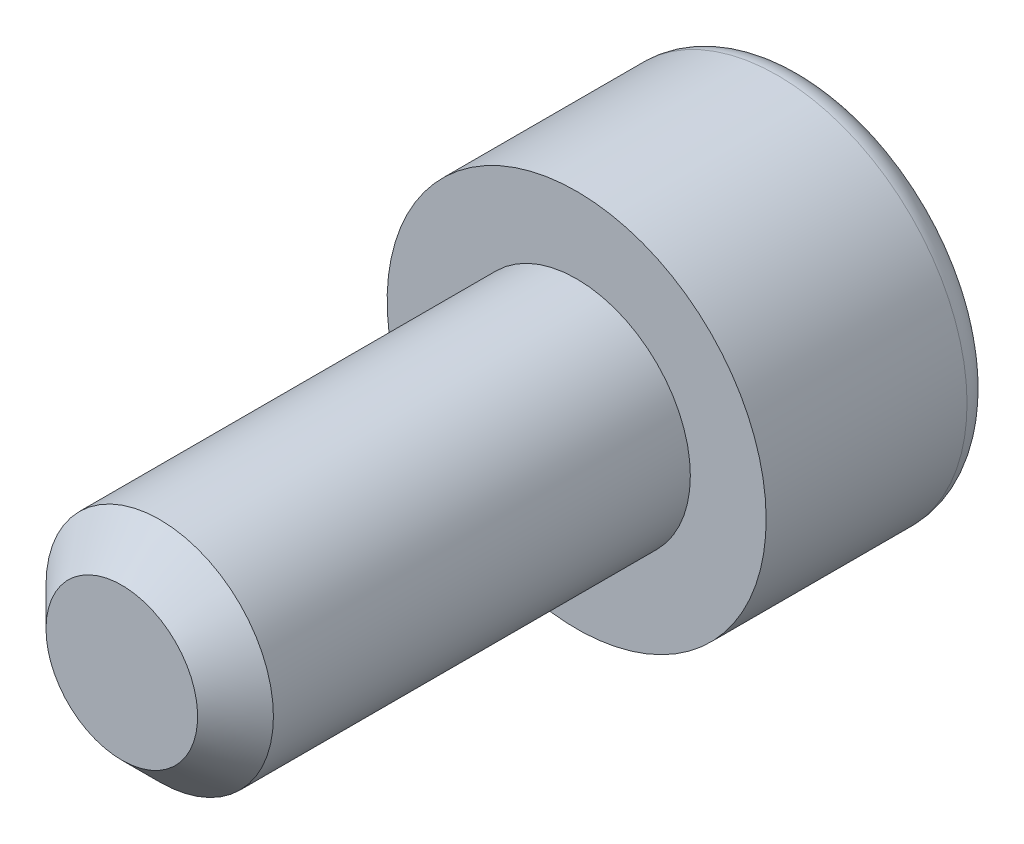
ISO-10303-21;
HEADER;
FILE_DESCRIPTION(('STEP AP214'),'2;1');
FILE_NAME('part.step','',(''),(''),'','','');
FILE_SCHEMA(('AUTOMOTIVE_DESIGN { 1 0 10303 214 1 1 1 1 }'));
ENDSEC;
DATA;
#1=APPLICATION_CONTEXT('core data for automotive mechanical design processes');
#2=APPLICATION_PROTOCOL_DEFINITION('international standard','automotive_design',2000,#1);
#3=PRODUCT_CONTEXT('',#1,'mechanical');
#4=PRODUCT('Part','Part','',(#3));
#5=PRODUCT_RELATED_PRODUCT_CATEGORY('part','',(#4));
#6=PRODUCT_DEFINITION_FORMATION('','',#4);
#7=PRODUCT_DEFINITION_CONTEXT('part definition',#1,'design');
#8=PRODUCT_DEFINITION('design','',#6,#7);
#9=PRODUCT_DEFINITION_SHAPE('','',#8);
#10=(LENGTH_UNIT() NAMED_UNIT(*) SI_UNIT(.MILLI.,.METRE.));
#11=(NAMED_UNIT(*) PLANE_ANGLE_UNIT() SI_UNIT($,.RADIAN.));
#12=(NAMED_UNIT(*) SI_UNIT($,.STERADIAN.) SOLID_ANGLE_UNIT());
#13=UNCERTAINTY_MEASURE_WITH_UNIT(LENGTH_MEASURE(1.E-05),#10,'distance_accuracy_value','');
#14=(GEOMETRIC_REPRESENTATION_CONTEXT(3) GLOBAL_UNCERTAINTY_ASSIGNED_CONTEXT((#13)) GLOBAL_UNIT_ASSIGNED_CONTEXT((#10,
#11,#12)) REPRESENTATION_CONTEXT('',''));
#15=CARTESIAN_POINT('',(0.,0.,0.));
#16=DIRECTION('',(0.,0.,1.));
#17=DIRECTION('',(1.,0.,0.));
#18=AXIS2_PLACEMENT_3D('',#15,#16,#17);
#19=CARTESIAN_POINT('',(-149.544155877285,25.4558441227155,-1131.55662432703));
#20=DIRECTION('',(0.,0.,-1.));
#21=DIRECTION('',(0.707106781186536,0.707106781186559,0.));
#22=AXIS2_PLACEMENT_3D('',#19,#20,#21);
#23=CONICAL_SURFACE('',#22,1732.05080756888,1.0471975511966);
#24=CARTESIAN_POINT('',(-149.544155877285,25.4558441227154,-131.556624327026));
#25=VERTEX_POINT('',#24);
#26=VERTEX_LOOP('',#25);
#27=FACE_BOUND('',#26,.T.);
#28=CARTESIAN_POINT('',(-149.544155877285,25.4558441227155,-133.));
#29=DIRECTION('',(0.,0.,-1.));
#30=DIRECTION('',(0.707106781186668,-0.707106781186427,0.));
#31=AXIS2_PLACEMENT_3D('',#28,#29,#30);
#32=CIRCLE('',#31,2.49999999999545);
#33=CARTESIAN_POINT('',(-147.776388924318,23.6880771697491,-133.));
#34=VERTEX_POINT('',#33);
#35=CARTESIAN_POINT('',(-150.191203490041,23.0410295569928,-133.));
#36=VERTEX_POINT('',#35);
#37=EDGE_CURVE('E96',#34,#36,#32,.T.);
#38=ORIENTED_EDGE('',*,*,#37,.T.);
#39=CARTESIAN_POINT('',(-149.544155877285,25.4558441227155,-133.));
#40=DIRECTION('',(0.,0.,-1.));
#41=DIRECTION('',(-0.258819045102405,-0.965925826289099,0.));
#42=AXIS2_PLACEMENT_3D('',#39,#40,#41);
#43=CIRCLE('',#42,2.49999999999545);
#44=CARTESIAN_POINT('',(-151.958970443008,24.8087965099591,-133.));
#45=VERTEX_POINT('',#44);
#46=EDGE_CURVE('E99',#36,#45,#43,.T.);
#47=ORIENTED_EDGE('',*,*,#46,.T.);
#48=CARTESIAN_POINT('',(-149.544155877285,25.4558441227155,-133.));
#49=DIRECTION('',(0.,0.,-1.));
#50=DIRECTION('',(-0.965925826289067,-0.258819045102524,0.));
#51=AXIS2_PLACEMENT_3D('',#48,#49,#50);
#52=CIRCLE('',#51,2.49999999999545);
#53=CARTESIAN_POINT('',(-151.311922830251,27.2236110756818,-133.));
#54=VERTEX_POINT('',#53);
#55=EDGE_CURVE('E116',#45,#54,#52,.T.);
#56=ORIENTED_EDGE('',*,*,#55,.T.);
#57=CARTESIAN_POINT('',(-149.544155877285,25.4558441227155,-133.));
#58=DIRECTION('',(0.,0.,-1.));
#59=DIRECTION('',(-0.707106781186488,0.707106781186607,0.));
#60=AXIS2_PLACEMENT_3D('',#57,#58,#59);
#61=CIRCLE('',#60,2.49999999999545);
#62=CARTESIAN_POINT('',(-148.897108264529,27.8706586884381,-133.));
#63=VERTEX_POINT('',#62);
#64=EDGE_CURVE('E122',#54,#63,#61,.T.);
#65=ORIENTED_EDGE('',*,*,#64,.T.);
#66=CARTESIAN_POINT('',(-149.544155877285,25.4558441227155,-133.));
#67=DIRECTION('',(0.,0.,-1.));
#68=DIRECTION('',(0.258819045102405,0.965925826289099,0.));
#69=AXIS2_PLACEMENT_3D('',#66,#67,#68);
#70=CIRCLE('',#69,2.49999999999545);
#71=CARTESIAN_POINT('',(-147.129341311562,26.1028917354718,-133.));
#72=VERTEX_POINT('',#71);
#73=EDGE_CURVE('E134',#63,#72,#70,.T.);
#74=ORIENTED_EDGE('',*,*,#73,.T.);
#75=CARTESIAN_POINT('',(-149.544155877285,25.4558441227155,-133.));
#76=DIRECTION('',(0.,0.,-1.));
#77=DIRECTION('',(0.965925826289077,0.25881904510249,0.));
#78=AXIS2_PLACEMENT_3D('',#75,#76,#77);
#79=CIRCLE('',#78,2.49999999999545);
#80=EDGE_CURVE('E103',#72,#34,#79,.T.);
#81=ORIENTED_EDGE('',*,*,#80,.T.);
#82=EDGE_LOOP('',(#38,#47,#56,#65,#74,#81));
#83=FACE_BOUND('',#82,.T.);
#84=ADVANCED_FACE('F17',(#27,#83),#23,.F.);
#85=CARTESIAN_POINT('',(-149.544155877285,25.4558441227155,-133.));
#86=DIRECTION('',(0.,0.,-1.));
#87=DIRECTION('',(0.707106781186536,0.70710678118656,0.));
#88=AXIS2_PLACEMENT_3D('',#85,#86,#87);
#89=PLANE('',#88);
#90=DIRECTION('',(-0.707106781186539,-0.707106781186556,0.));
#91=VECTOR('',#90,1.);
#92=CARTESIAN_POINT('',(-147.776388924318,23.6880771697494,-133.));
#93=LINE('',#92,#91);
#94=CARTESIAN_POINT('',(-148.797009650478,22.6674564435894,-133.));
#95=VERTEX_POINT('',#94);
#96=EDGE_CURVE('E143',#34,#95,#93,.T.);
#97=ORIENTED_EDGE('',*,*,#96,.T.);
#98=DIRECTION('',(-0.965925826289073,0.258819045102502,0.));
#99=VECTOR('',#98,1.);
#100=CARTESIAN_POINT('',(-148.797009650478,22.6674564435894,-133.));
#101=LINE('',#100,#99);
#102=EDGE_CURVE('E148',#95,#36,#101,.T.);
#103=ORIENTED_EDGE('',*,*,#102,.T.);
#104=ORIENTED_EDGE('',*,*,#37,.F.);
#105=EDGE_LOOP('',(#97,#103,#104));
#106=FACE_BOUND('',#105,.T.);
#107=ADVANCED_FACE('F90',(#106),#89,.T.);
#108=DIRECTION('',(-0.965925826289071,0.25881904510251,0.));
#109=VECTOR('',#108,1.);
#110=CARTESIAN_POINT('',(-150.191203490041,23.0410295569927,-133.));
#111=LINE('',#110,#109);
#112=CARTESIAN_POINT('',(-151.585397329604,23.4146026703961,-133.));
#113=VERTEX_POINT('',#112);
#114=EDGE_CURVE('E113',#36,#113,#111,.T.);
#115=ORIENTED_EDGE('',*,*,#114,.T.);
#116=DIRECTION('',(-0.258819045102532,0.965925826289065,0.));
#117=VECTOR('',#116,1.);
#118=CARTESIAN_POINT('',(-151.585397329604,23.4146026703961,-133.));
#119=LINE('',#118,#117);
#120=EDGE_CURVE('E114',#113,#45,#119,.T.);
#121=ORIENTED_EDGE('',*,*,#120,.T.);
#122=ORIENTED_EDGE('',*,*,#46,.F.);
#123=EDGE_LOOP('',(#115,#121,#122));
#124=FACE_BOUND('',#123,.T.);
#125=ADVANCED_FACE('F112',(#124),#89,.T.);
#126=DIRECTION('',(-0.258819045102537,0.965925826289064,0.));
#127=VECTOR('',#126,1.);
#128=CARTESIAN_POINT('',(-151.958970443007,24.8087965099593,-133.));
#129=LINE('',#128,#127);
#130=CARTESIAN_POINT('',(-152.332543556411,26.2029903495221,-133.));
#131=VERTEX_POINT('',#130);
#132=EDGE_CURVE('E161',#45,#131,#129,.T.);
#133=ORIENTED_EDGE('',*,*,#132,.T.);
#134=DIRECTION('',(0.707106781186533,0.707106781186562,0.));
#135=VECTOR('',#134,1.);
#136=CARTESIAN_POINT('',(-152.332543556411,26.2029903495221,-133.));
#137=LINE('',#136,#135);
#138=EDGE_CURVE('E167',#131,#54,#137,.T.);
#139=ORIENTED_EDGE('',*,*,#138,.T.);
#140=ORIENTED_EDGE('',*,*,#55,.F.);
#141=EDGE_LOOP('',(#133,#139,#140));
#142=FACE_BOUND('',#141,.T.);
#143=ADVANCED_FACE('F357',(#142),#89,.T.);
#144=DIRECTION('',(0.707106781186538,0.707106781186557,0.));
#145=VECTOR('',#144,1.);
#146=CARTESIAN_POINT('',(-151.311922830251,27.223611075682,-133.));
#147=LINE('',#146,#145);
#148=CARTESIAN_POINT('',(-150.291302104092,28.2442318018415,-133.));
#149=VERTEX_POINT('',#148);
#150=EDGE_CURVE('E173',#54,#149,#147,.T.);
#151=ORIENTED_EDGE('',*,*,#150,.T.);
#152=DIRECTION('',(0.965925826289073,-0.258819045102502,0.));
#153=VECTOR('',#152,1.);
#154=CARTESIAN_POINT('',(-150.291302104092,28.2442318018415,-133.));
#155=LINE('',#154,#153);
#156=EDGE_CURVE('E179',#149,#63,#155,.T.);
#157=ORIENTED_EDGE('',*,*,#156,.T.);
#158=ORIENTED_EDGE('',*,*,#64,.F.);
#159=EDGE_LOOP('',(#151,#157,#158));
#160=FACE_BOUND('',#159,.T.);
#161=ADVANCED_FACE('F364',(#160),#89,.T.);
#162=DIRECTION('',(0.965925826289071,-0.258819045102509,0.));
#163=VECTOR('',#162,1.);
#164=CARTESIAN_POINT('',(-148.897108264529,27.8706586884382,-133.));
#165=LINE('',#164,#163);
#166=CARTESIAN_POINT('',(-147.502914424966,27.4970855750348,-133.));
#167=VERTEX_POINT('',#166);
#168=EDGE_CURVE('E185',#63,#167,#165,.T.);
#169=ORIENTED_EDGE('',*,*,#168,.T.);
#170=DIRECTION('',(0.258819045102533,-0.965925826289065,0.));
#171=VECTOR('',#170,1.);
#172=CARTESIAN_POINT('',(-147.502914424966,27.4970855750348,-133.));
#173=LINE('',#172,#171);
#174=EDGE_CURVE('E191',#167,#72,#173,.T.);
#175=ORIENTED_EDGE('',*,*,#174,.T.);
#176=ORIENTED_EDGE('',*,*,#73,.F.);
#177=EDGE_LOOP('',(#169,#175,#176));
#178=FACE_BOUND('',#177,.T.);
#179=ADVANCED_FACE('F359',(#178),#89,.T.);
#180=DIRECTION('',(0.258819045102537,-0.965925826289064,0.));
#181=VECTOR('',#180,1.);
#182=CARTESIAN_POINT('',(-147.129341311563,26.1028917354717,-133.));
#183=LINE('',#182,#181);
#184=CARTESIAN_POINT('',(-146.755768198159,24.7086978959088,-133.));
#185=VERTEX_POINT('',#184);
#186=EDGE_CURVE('E197',#72,#185,#183,.T.);
#187=ORIENTED_EDGE('',*,*,#186,.T.);
#188=DIRECTION('',(-0.707106781186538,-0.707106781186557,0.));
#189=VECTOR('',#188,1.);
#190=CARTESIAN_POINT('',(-146.755768198159,24.7086978959088,-133.));
#191=LINE('',#190,#189);
#192=EDGE_CURVE('E203',#185,#34,#191,.T.);
#193=ORIENTED_EDGE('',*,*,#192,.T.);
#194=ORIENTED_EDGE('',*,*,#80,.F.);
#195=EDGE_LOOP('',(#187,#193,#194));
#196=FACE_BOUND('',#195,.T.);
#197=ADVANCED_FACE('F351',(#196),#89,.T.);
#198=CARTESIAN_POINT('',(-146.755768198159,24.7086978959088,-133.));
#199=DIRECTION('',(0.707106781186559,-0.707106781186536,0.));
#200=DIRECTION('',(-0.707106781186536,-0.707106781186559,0.));
#201=AXIS2_PLACEMENT_3D('',#198,#199,#200);
#202=PLANE('',#201);
#203=ORIENTED_EDGE('',*,*,#192,.F.);
#204=DIRECTION('',(0.,0.,-1.));
#205=VECTOR('',#204,1.);
#206=CARTESIAN_POINT('',(-146.755768198159,24.7086978959088,-133.));
#207=LINE('',#206,#205);
#208=CARTESIAN_POINT('',(-146.755768198159,24.7086978959088,-138.));
#209=VERTEX_POINT('',#208);
#210=EDGE_CURVE('E209',#185,#209,#207,.T.);
#211=ORIENTED_EDGE('',*,*,#210,.T.);
#212=DIRECTION('',(-0.707106781186538,-0.707106781186557,0.));
#213=VECTOR('',#212,1.);
#214=CARTESIAN_POINT('',(-146.755768198159,24.7086978959088,-138.));
#215=LINE('',#214,#213);
#216=CARTESIAN_POINT('',(-148.797009650478,22.6674564435894,-138.));
#217=VERTEX_POINT('',#216);
#218=EDGE_CURVE('E215',#209,#217,#215,.T.);
#219=ORIENTED_EDGE('',*,*,#218,.T.);
#220=DIRECTION('',(0.,0.,-1.));
#221=VECTOR('',#220,1.);
#222=CARTESIAN_POINT('',(-148.797009650478,22.6674564435894,-133.));
#223=LINE('',#222,#221);
#224=EDGE_CURVE('E221',#95,#217,#223,.T.);
#225=ORIENTED_EDGE('',*,*,#224,.F.);
#226=ORIENTED_EDGE('',*,*,#96,.F.);
#227=EDGE_LOOP('',(#203,#211,#219,#225,#226));
#228=FACE_BOUND('',#227,.T.);
#229=ADVANCED_FACE('F347',(#228),#202,.F.);
#230=CARTESIAN_POINT('',(-148.797009650478,22.6674564435894,-133.));
#231=DIRECTION('',(-0.258819045102504,-0.965925826289073,0.));
#232=DIRECTION('',(-0.965925826289073,0.258819045102504,0.));
#233=AXIS2_PLACEMENT_3D('',#230,#231,#232);
#234=PLANE('',#233);
#235=ORIENTED_EDGE('',*,*,#102,.F.);
#236=ORIENTED_EDGE('',*,*,#224,.T.);
#237=DIRECTION('',(-0.965925826289072,0.258819045102506,0.));
#238=VECTOR('',#237,1.);
#239=CARTESIAN_POINT('',(-148.797009650478,22.6674564435894,-138.));
#240=LINE('',#239,#238);
#241=CARTESIAN_POINT('',(-151.585397329604,23.4146026703961,-138.));
#242=VERTEX_POINT('',#241);
#243=EDGE_CURVE('E227',#217,#242,#240,.T.);
#244=ORIENTED_EDGE('',*,*,#243,.T.);
#245=DIRECTION('',(0.,0.,-1.));
#246=VECTOR('',#245,1.);
#247=CARTESIAN_POINT('',(-151.585397329604,23.4146026703961,-133.));
#248=LINE('',#247,#246);
#249=EDGE_CURVE('E233',#113,#242,#248,.T.);
#250=ORIENTED_EDGE('',*,*,#249,.F.);
#251=ORIENTED_EDGE('',*,*,#114,.F.);
#252=EDGE_LOOP('',(#235,#236,#244,#250,#251));
#253=FACE_BOUND('',#252,.T.);
#254=ADVANCED_FACE('F343',(#253),#234,.F.);
#255=CARTESIAN_POINT('',(-151.585397329604,23.4146026703961,-133.));
#256=DIRECTION('',(-0.965925826289064,-0.258819045102537,0.));
#257=DIRECTION('',(-0.258819045102537,0.965925826289064,0.));
#258=AXIS2_PLACEMENT_3D('',#255,#256,#257);
#259=PLANE('',#258);
#260=ORIENTED_EDGE('',*,*,#120,.F.);
#261=ORIENTED_EDGE('',*,*,#249,.T.);
#262=DIRECTION('',(-0.258819045102534,0.965925826289065,0.));
#263=VECTOR('',#262,1.);
#264=CARTESIAN_POINT('',(-151.585397329604,23.4146026703961,-138.));
#265=LINE('',#264,#263);
#266=CARTESIAN_POINT('',(-152.332543556411,26.2029903495221,-138.));
#267=VERTEX_POINT('',#266);
#268=EDGE_CURVE('E239',#242,#267,#265,.T.);
#269=ORIENTED_EDGE('',*,*,#268,.T.);
#270=DIRECTION('',(0.,0.,-1.));
#271=VECTOR('',#270,1.);
#272=CARTESIAN_POINT('',(-152.332543556411,26.2029903495221,-133.));
#273=LINE('',#272,#271);
#274=EDGE_CURVE('E245',#131,#267,#273,.T.);
#275=ORIENTED_EDGE('',*,*,#274,.F.);
#276=ORIENTED_EDGE('',*,*,#132,.F.);
#277=EDGE_LOOP('',(#260,#261,#269,#275,#276));
#278=FACE_BOUND('',#277,.T.);
#279=ADVANCED_FACE('F339',(#278),#259,.F.);
#280=CARTESIAN_POINT('',(-152.332543556411,26.2029903495221,-133.));
#281=DIRECTION('',(-0.70710678118656,0.707106781186536,0.));
#282=DIRECTION('',(0.707106781186536,0.70710678118656,0.));
#283=AXIS2_PLACEMENT_3D('',#280,#281,#282);
#284=PLANE('',#283);
#285=ORIENTED_EDGE('',*,*,#138,.F.);
#286=ORIENTED_EDGE('',*,*,#274,.T.);
#287=DIRECTION('',(0.707106781186535,0.70710678118656,0.));
#288=VECTOR('',#287,1.);
#289=CARTESIAN_POINT('',(-152.332543556411,26.2029903495221,-138.));
#290=LINE('',#289,#288);
#291=CARTESIAN_POINT('',(-150.291302104092,28.2442318018415,-138.));
#292=VERTEX_POINT('',#291);
#293=EDGE_CURVE('E251',#267,#292,#290,.T.);
#294=ORIENTED_EDGE('',*,*,#293,.T.);
#295=DIRECTION('',(0.,0.,-1.));
#296=VECTOR('',#295,1.);
#297=CARTESIAN_POINT('',(-150.291302104092,28.2442318018415,-133.));
#298=LINE('',#297,#296);
#299=EDGE_CURVE('E256',#149,#292,#298,.T.);
#300=ORIENTED_EDGE('',*,*,#299,.F.);
#301=ORIENTED_EDGE('',*,*,#150,.F.);
#302=EDGE_LOOP('',(#285,#286,#294,#300,#301));
#303=FACE_BOUND('',#302,.T.);
#304=ADVANCED_FACE('F335',(#303),#284,.F.);
#305=CARTESIAN_POINT('',(-150.291302104092,28.2442318018415,-133.));
#306=DIRECTION('',(0.258819045102505,0.965925826289073,0.));
#307=DIRECTION('',(0.965925826289073,-0.258819045102505,0.));
#308=AXIS2_PLACEMENT_3D('',#305,#306,#307);
#309=PLANE('',#308);
#310=ORIENTED_EDGE('',*,*,#156,.F.);
#311=ORIENTED_EDGE('',*,*,#299,.T.);
#312=DIRECTION('',(0.965925826289072,-0.258819045102506,0.));
#313=VECTOR('',#312,1.);
#314=CARTESIAN_POINT('',(-150.291302104092,28.2442318018415,-138.));
#315=LINE('',#314,#313);
#316=CARTESIAN_POINT('',(-147.502914424966,27.4970855750348,-138.));
#317=VERTEX_POINT('',#316);
#318=EDGE_CURVE('E37',#292,#317,#315,.T.);
#319=ORIENTED_EDGE('',*,*,#318,.T.);
#320=DIRECTION('',(0.,0.,-1.));
#321=VECTOR('',#320,1.);
#322=CARTESIAN_POINT('',(-147.502914424966,27.4970855750348,-133.));
#323=LINE('',#322,#321);
#324=EDGE_CURVE('E266',#167,#317,#323,.T.);
#325=ORIENTED_EDGE('',*,*,#324,.F.);
#326=ORIENTED_EDGE('',*,*,#168,.F.);
#327=EDGE_LOOP('',(#310,#311,#319,#325,#326));
#328=FACE_BOUND('',#327,.T.);
#329=ADVANCED_FACE('F331',(#328),#309,.F.);
#330=CARTESIAN_POINT('',(-147.502914424966,27.4970855750348,-133.));
#331=DIRECTION('',(0.965925826289064,0.258819045102537,0.));
#332=DIRECTION('',(0.258819045102537,-0.965925826289064,0.));
#333=AXIS2_PLACEMENT_3D('',#330,#331,#332);
#334=PLANE('',#333);
#335=ORIENTED_EDGE('',*,*,#174,.F.);
#336=ORIENTED_EDGE('',*,*,#324,.T.);
#337=DIRECTION('',(0.258819045102535,-0.965925826289065,0.));
#338=VECTOR('',#337,1.);
#339=CARTESIAN_POINT('',(-147.502914424966,27.4970855750348,-138.));
#340=LINE('',#339,#338);
#341=EDGE_CURVE('E33',#317,#209,#340,.T.);
#342=ORIENTED_EDGE('',*,*,#341,.T.);
#343=ORIENTED_EDGE('',*,*,#210,.F.);
#344=ORIENTED_EDGE('',*,*,#186,.F.);
#345=EDGE_LOOP('',(#335,#336,#342,#343,#344));
#346=FACE_BOUND('',#345,.T.);
#347=ADVANCED_FACE('F328',(#346),#334,.F.);
#348=CARTESIAN_POINT('',(-152.584715036387,28.4964032818176,-138.));
#349=DIRECTION('',(0.,0.,-1.));
#350=DIRECTION('',(0.707106781186536,0.70710678118656,0.));
#351=AXIS2_PLACEMENT_3D('',#348,#349,#350);
#352=PLANE('',#351);
#353=ORIENTED_EDGE('',*,*,#243,.F.);
#354=ORIENTED_EDGE('',*,*,#218,.F.);
#355=ORIENTED_EDGE('',*,*,#341,.F.);
#356=ORIENTED_EDGE('',*,*,#318,.F.);
#357=ORIENTED_EDGE('',*,*,#293,.F.);
#358=ORIENTED_EDGE('',*,*,#268,.F.);
#359=EDGE_LOOP('',(#353,#354,#355,#356,#357,#358));
#360=FACE_BOUND('',#359,.T.);
#361=CARTESIAN_POINT('',(-149.544155877285,25.4558441227155,-138.));
#362=DIRECTION('',(0.,0.,-1.));
#363=DIRECTION('',(0.707106781186533,0.707106781186562,0.));
#364=AXIS2_PLACEMENT_3D('',#361,#362,#363);
#365=CIRCLE('',#364,4.29999987396401);
#366=CARTESIAN_POINT('',(-146.503596807304,28.4964031926968,-138.));
#367=VERTEX_POINT('',#366);
#368=EDGE_CURVE('E276',#367,#367,#365,.T.);
#369=ORIENTED_EDGE('',*,*,#368,.T.);
#370=EDGE_LOOP('',(#369));
#371=FACE_BOUND('',#370,.T.);
#372=ADVANCED_FACE('F324',(#360,#371),#352,.T.);
#373=CARTESIAN_POINT('',(-149.544155877285,25.4558441227155,-137.3));
#374=DIRECTION('',(0.,0.,-1.));
#375=DIRECTION('',(0.707106781186535,0.70710678118656,0.));
#376=AXIS2_PLACEMENT_3D('',#373,#374,#375);
#377=TOROIDAL_SURFACE('',#376,4.3,0.7);
#378=CARTESIAN_POINT('',(-149.544155877285,25.4558441227155,-137.3));
#379=DIRECTION('',(0.,0.,-1.));
#380=DIRECTION('',(0.707106781186536,0.707106781186559,0.));
#381=AXIS2_PLACEMENT_3D('',#378,#379,#380);
#382=CIRCLE('',#381,5.);
#383=CARTESIAN_POINT('',(-146.008621971352,28.9913780286483,-137.3));
#384=VERTEX_POINT('',#383);
#385=EDGE_CURVE('E282',#384,#384,#382,.T.);
#386=ORIENTED_EDGE('',*,*,#385,.T.);
#387=EDGE_LOOP('',(#386));
#388=FACE_BOUND('',#387,.T.);
#389=ORIENTED_EDGE('',*,*,#368,.F.);
#390=EDGE_LOOP('',(#389));
#391=FACE_BOUND('',#390,.T.);
#392=ADVANCED_FACE('F320',(#388,#391),#377,.T.);
#393=CARTESIAN_POINT('',(-149.544155877285,25.4558441227155,-163.684638261637));
#394=DIRECTION('',(0.,0.,-1.));
#395=DIRECTION('',(0.707106781186535,0.70710678118656,0.));
#396=AXIS2_PLACEMENT_3D('',#393,#394,#395);
#397=CYLINDRICAL_SURFACE('',#396,5.);
#398=CARTESIAN_POINT('',(-149.544155877285,25.4558441227155,-132.));
#399=DIRECTION('',(0.,0.,-1.));
#400=DIRECTION('',(0.707106781186536,0.707106781186559,0.));
#401=AXIS2_PLACEMENT_3D('',#398,#399,#400);
#402=CIRCLE('',#401,5.);
#403=CARTESIAN_POINT('',(-146.008621971352,28.9913780286483,-132.));
#404=VERTEX_POINT('',#403);
#405=EDGE_CURVE('E286',#404,#404,#402,.T.);
#406=ORIENTED_EDGE('',*,*,#405,.T.);
#407=EDGE_LOOP('',(#406));
#408=FACE_BOUND('',#407,.T.);
#409=ORIENTED_EDGE('',*,*,#385,.F.);
#410=EDGE_LOOP('',(#409));
#411=FACE_BOUND('',#410,.T.);
#412=ADVANCED_FACE('F316',(#408,#411),#397,.T.);
#413=CARTESIAN_POINT('',(-153.079689783218,28.9913780286481,-132.));
#414=DIRECTION('',(0.,0.,1.));
#415=DIRECTION('',(-0.707106781186536,-0.70710678118656,0.));
#416=AXIS2_PLACEMENT_3D('',#413,#414,#415);
#417=PLANE('',#416);
#418=CARTESIAN_POINT('',(-149.544155877285,25.4558441227155,-132.));
#419=DIRECTION('',(0.,0.,-1.));
#420=DIRECTION('',(0.707106781186535,0.70710678118656,0.));
#421=AXIS2_PLACEMENT_3D('',#418,#419,#420);
#422=CIRCLE('',#421,3.);
#423=CARTESIAN_POINT('',(-147.422835533725,27.5771644662752,-132.));
#424=VERTEX_POINT('',#423);
#425=EDGE_CURVE('E290',#424,#424,#422,.T.);
#426=ORIENTED_EDGE('',*,*,#425,.T.);
#427=EDGE_LOOP('',(#426));
#428=FACE_BOUND('',#427,.T.);
#429=ORIENTED_EDGE('',*,*,#405,.F.);
#430=EDGE_LOOP('',(#429));
#431=FACE_BOUND('',#430,.T.);
#432=ADVANCED_FACE('F311',(#428,#431),#417,.T.);
#433=CARTESIAN_POINT('',(-149.544155877285,25.4558441227155,-163.684638261637));
#434=DIRECTION('',(0.,0.,-1.));
#435=DIRECTION('',(0.707106781186536,0.707106781186559,0.));
#436=AXIS2_PLACEMENT_3D('',#433,#434,#435);
#437=CYLINDRICAL_SURFACE('',#436,3.);
#438=CARTESIAN_POINT('',(-149.544155877285,25.4558441227155,-121.));
#439=DIRECTION('',(0.,0.,-1.));
#440=DIRECTION('',(0.707106781186535,0.70710678118656,0.));
#441=AXIS2_PLACEMENT_3D('',#438,#439,#440);
#442=CIRCLE('',#441,3.);
#443=CARTESIAN_POINT('',(-147.422835533725,27.5771644662752,-121.));
#444=VERTEX_POINT('',#443);
#445=EDGE_CURVE('E26',#444,#444,#442,.T.);
#446=ORIENTED_EDGE('',*,*,#445,.T.);
#447=EDGE_LOOP('',(#446));
#448=FACE_BOUND('',#447,.T.);
#449=ORIENTED_EDGE('',*,*,#425,.F.);
#450=EDGE_LOOP('',(#449));
#451=FACE_BOUND('',#450,.T.);
#452=ADVANCED_FACE('F299',(#448,#451),#437,.T.);
#453=CARTESIAN_POINT('',(-149.544155877285,25.4558441227155,-121.));
#454=DIRECTION('',(0.,0.,-1.));
#455=DIRECTION('',(0.707106781186537,0.707106781186559,0.));
#456=AXIS2_PLACEMENT_3D('',#453,#454,#455);
#457=CONICAL_SURFACE('',#456,3.,0.785398163397448);
#458=CARTESIAN_POINT('',(-149.544155877285,25.4558441227155,-120.));
#459=DIRECTION('',(0.,0.,-1.));
#460=DIRECTION('',(0.707106781186537,0.707106781186558,0.));
#461=AXIS2_PLACEMENT_3D('',#458,#459,#460);
#462=CIRCLE('',#461,2.);
#463=CARTESIAN_POINT('',(-148.129942314912,26.8700576850886,-120.));
#464=VERTEX_POINT('',#463);
#465=EDGE_CURVE('E11',#464,#464,#462,.T.);
#466=ORIENTED_EDGE('',*,*,#465,.T.);
#467=EDGE_LOOP('',(#466));
#468=FACE_BOUND('',#467,.T.);
#469=ORIENTED_EDGE('',*,*,#445,.F.);
#470=EDGE_LOOP('',(#469));
#471=FACE_BOUND('',#470,.T.);
#472=ADVANCED_FACE('F302',(#468,#471),#457,.T.);
#473=CARTESIAN_POINT('',(-150.958369439658,26.8700576850885,-120.));
#474=DIRECTION('',(0.,0.,1.));
#475=DIRECTION('',(-0.707106781186536,-0.70710678118656,0.));
#476=AXIS2_PLACEMENT_3D('',#473,#474,#475);
#477=PLANE('',#476);
#478=ORIENTED_EDGE('',*,*,#465,.F.);
#479=EDGE_LOOP('',(#478));
#480=FACE_BOUND('',#479,.T.);
#481=ADVANCED_FACE('F19',(#480),#477,.T.);
#482=CLOSED_SHELL('',(#84,#107,#125,#143,#161,#179,#197,#229,#254,#279,#304,#329,#347,#372,#392,
#412,#432,#452,#472,#481));
#483=MANIFOLD_SOLID_BREP('B1',#482);
#484=ADVANCED_BREP_SHAPE_REPRESENTATION('',(#18,#483),#14);
#485=SHAPE_DEFINITION_REPRESENTATION(#9,#484);
ENDSEC;
END-ISO-10303-21;
